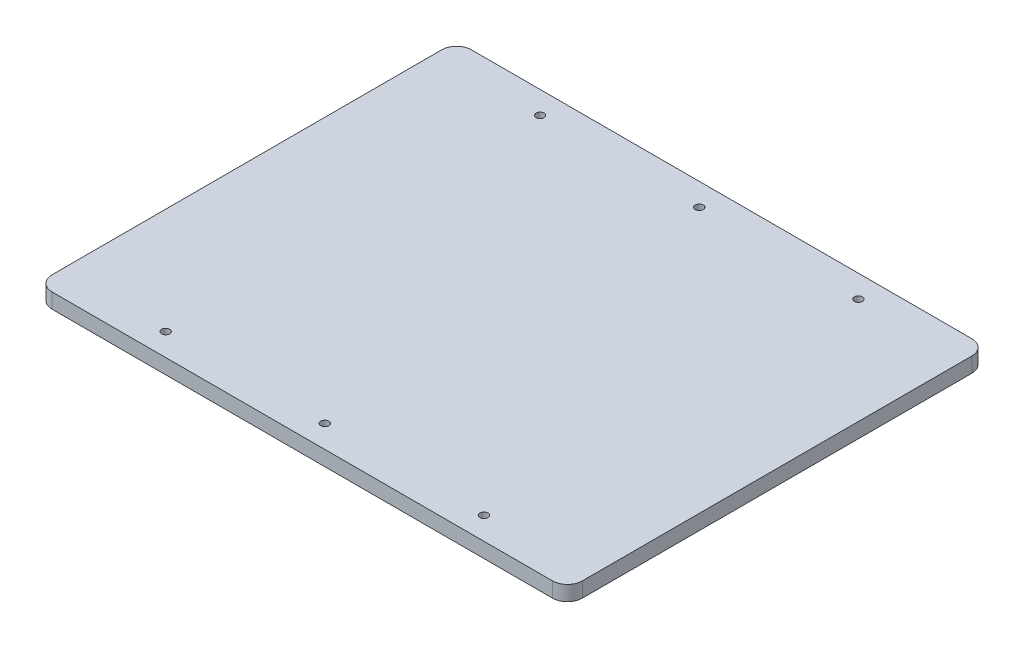
ISO-10303-21;
HEADER;
FILE_DESCRIPTION(('STEP AP214'),'2;1');
FILE_NAME('part.step','',(''),(''),'','','');
FILE_SCHEMA(('AUTOMOTIVE_DESIGN { 1 0 10303 214 1 1 1 1 }'));
ENDSEC;
DATA;
#1=APPLICATION_CONTEXT('core data for automotive mechanical design processes');
#2=APPLICATION_PROTOCOL_DEFINITION('international standard','automotive_design',2000,#1);
#3=PRODUCT_CONTEXT('',#1,'mechanical');
#4=PRODUCT('Part','Part','',(#3));
#5=PRODUCT_RELATED_PRODUCT_CATEGORY('part','',(#4));
#6=PRODUCT_DEFINITION_FORMATION('','',#4);
#7=PRODUCT_DEFINITION_CONTEXT('part definition',#1,'design');
#8=PRODUCT_DEFINITION('design','',#6,#7);
#9=PRODUCT_DEFINITION_SHAPE('','',#8);
#10=(LENGTH_UNIT() NAMED_UNIT(*) SI_UNIT(.MILLI.,.METRE.));
#11=(NAMED_UNIT(*) PLANE_ANGLE_UNIT() SI_UNIT($,.RADIAN.));
#12=(NAMED_UNIT(*) SI_UNIT($,.STERADIAN.) SOLID_ANGLE_UNIT());
#13=UNCERTAINTY_MEASURE_WITH_UNIT(LENGTH_MEASURE(1.E-05),#10,'distance_accuracy_value','');
#14=(GEOMETRIC_REPRESENTATION_CONTEXT(3) GLOBAL_UNCERTAINTY_ASSIGNED_CONTEXT((#13)) GLOBAL_UNIT_ASSIGNED_CONTEXT((#10,
#11,#12)) REPRESENTATION_CONTEXT('',''));
#15=CARTESIAN_POINT('',(0.,0.,0.));
#16=DIRECTION('',(0.,0.,1.));
#17=DIRECTION('',(1.,0.,0.));
#18=AXIS2_PLACEMENT_3D('',#15,#16,#17);
#19=CARTESIAN_POINT('',(-106.045,6.35,82.55));
#20=DIRECTION('',(0.,1.,0.));
#21=DIRECTION('',(0.,0.,1.));
#22=AXIS2_PLACEMENT_3D('',#19,#20,#21);
#23=PLANE('',#22);
#24=CARTESIAN_POINT('',(0.,6.35,79.375));
#25=DIRECTION('',(0.,1.,0.));
#26=DIRECTION('',(0.,0.,-1.));
#27=AXIS2_PLACEMENT_3D('',#24,#25,#26);
#28=CIRCLE('',#27,1.7);
#29=CARTESIAN_POINT('',(0.,6.35,77.675));
#30=VERTEX_POINT('',#29);
#31=EDGE_CURVE('E200',#30,#30,#28,.T.);
#32=ORIENTED_EDGE('',*,*,#31,.F.);
#33=EDGE_LOOP('',(#32));
#34=FACE_BOUND('',#33,.T.);
#35=CARTESIAN_POINT('',(67.46875,6.35,-79.375));
#36=DIRECTION('',(0.,1.,0.));
#37=DIRECTION('',(0.,0.,1.));
#38=AXIS2_PLACEMENT_3D('',#35,#36,#37);
#39=CIRCLE('',#38,1.70000000000001);
#40=CARTESIAN_POINT('',(67.46875,6.35,-77.675));
#41=VERTEX_POINT('',#40);
#42=EDGE_CURVE('E188',#41,#41,#39,.T.);
#43=ORIENTED_EDGE('',*,*,#42,.F.);
#44=EDGE_LOOP('',(#43));
#45=FACE_BOUND('',#44,.T.);
#46=CARTESIAN_POINT('',(-67.47002,6.35,-79.375));
#47=DIRECTION('',(0.,1.,0.));
#48=DIRECTION('',(0.,0.,1.));
#49=AXIS2_PLACEMENT_3D('',#46,#47,#48);
#50=CIRCLE('',#49,1.70000000000001);
#51=CARTESIAN_POINT('',(-67.47002,6.35,-77.675));
#52=VERTEX_POINT('',#51);
#53=EDGE_CURVE('E134',#52,#52,#50,.T.);
#54=ORIENTED_EDGE('',*,*,#53,.F.);
#55=EDGE_LOOP('',(#54));
#56=FACE_BOUND('',#55,.T.);
#57=CARTESIAN_POINT('',(-106.045,6.35,82.55));
#58=DIRECTION('',(0.,1.,0.));
#59=DIRECTION('',(0.,0.,1.));
#60=AXIS2_PLACEMENT_3D('',#57,#58,#59);
#61=CIRCLE('',#60,6.35);
#62=CARTESIAN_POINT('',(-112.395,6.35,82.55));
#63=VERTEX_POINT('',#62);
#64=CARTESIAN_POINT('',(-106.045,6.35,88.9));
#65=VERTEX_POINT('',#64);
#66=EDGE_CURVE('E145',#63,#65,#61,.T.);
#67=ORIENTED_EDGE('',*,*,#66,.T.);
#68=DIRECTION('',(1.,0.,0.));
#69=VECTOR('',#68,1.);
#70=CARTESIAN_POINT('',(-106.045,6.35,88.9));
#71=LINE('',#70,#69);
#72=CARTESIAN_POINT('',(106.045,6.35,88.9));
#73=VERTEX_POINT('',#72);
#74=EDGE_CURVE('E93',#65,#73,#71,.T.);
#75=ORIENTED_EDGE('',*,*,#74,.T.);
#76=CARTESIAN_POINT('',(106.045,6.35,82.55));
#77=DIRECTION('',(0.,1.,0.));
#78=DIRECTION('',(0.,0.,-1.));
#79=AXIS2_PLACEMENT_3D('',#76,#77,#78);
#80=CIRCLE('',#79,6.35);
#81=CARTESIAN_POINT('',(112.395,6.35,82.55));
#82=VERTEX_POINT('',#81);
#83=EDGE_CURVE('E160',#73,#82,#80,.T.);
#84=ORIENTED_EDGE('',*,*,#83,.T.);
#85=DIRECTION('',(0.,0.,-1.));
#86=VECTOR('',#85,1.);
#87=CARTESIAN_POINT('',(112.395,6.35,-82.55));
#88=LINE('',#87,#86);
#89=CARTESIAN_POINT('',(112.395,6.35,-82.55));
#90=VERTEX_POINT('',#89);
#91=EDGE_CURVE('E173',#82,#90,#88,.T.);
#92=ORIENTED_EDGE('',*,*,#91,.T.);
#93=CARTESIAN_POINT('',(106.045,6.35,-82.55));
#94=DIRECTION('',(0.,1.,0.));
#95=DIRECTION('',(0.,0.,1.));
#96=AXIS2_PLACEMENT_3D('',#93,#94,#95);
#97=CIRCLE('',#96,6.35);
#98=CARTESIAN_POINT('',(106.045,6.35,-88.9));
#99=VERTEX_POINT('',#98);
#100=EDGE_CURVE('E112',#90,#99,#97,.T.);
#101=ORIENTED_EDGE('',*,*,#100,.T.);
#102=DIRECTION('',(-1.,0.,0.));
#103=VECTOR('',#102,1.);
#104=CARTESIAN_POINT('',(-106.045,6.35,-88.9));
#105=LINE('',#104,#103);
#106=CARTESIAN_POINT('',(-106.045,6.35,-88.9));
#107=VERTEX_POINT('',#106);
#108=EDGE_CURVE('E106',#99,#107,#105,.T.);
#109=ORIENTED_EDGE('',*,*,#108,.T.);
#110=CARTESIAN_POINT('',(-106.045,6.35,-82.55));
#111=DIRECTION('',(0.,1.,0.));
#112=DIRECTION('',(0.,0.,1.));
#113=AXIS2_PLACEMENT_3D('',#110,#111,#112);
#114=CIRCLE('',#113,6.35);
#115=CARTESIAN_POINT('',(-112.395,6.35,-82.55));
#116=VERTEX_POINT('',#115);
#117=EDGE_CURVE('E110',#107,#116,#114,.T.);
#118=ORIENTED_EDGE('',*,*,#117,.T.);
#119=DIRECTION('',(0.,0.,1.));
#120=VECTOR('',#119,1.);
#121=CARTESIAN_POINT('',(-112.395,6.35,-82.55));
#122=LINE('',#121,#120);
#123=EDGE_CURVE('E50',#116,#63,#122,.T.);
#124=ORIENTED_EDGE('',*,*,#123,.T.);
#125=EDGE_LOOP('',(#67,#75,#84,#92,#101,#109,#118,#124));
#126=FACE_BOUND('',#125,.T.);
#127=CARTESIAN_POINT('',(0.,6.35,-79.375));
#128=DIRECTION('',(0.,1.,0.));
#129=DIRECTION('',(0.,0.,1.));
#130=AXIS2_PLACEMENT_3D('',#127,#128,#129);
#131=CIRCLE('',#130,1.7);
#132=CARTESIAN_POINT('',(0.,6.35,-77.675));
#133=VERTEX_POINT('',#132);
#134=EDGE_CURVE('E182',#133,#133,#131,.T.);
#135=ORIENTED_EDGE('',*,*,#134,.F.);
#136=EDGE_LOOP('',(#135));
#137=FACE_BOUND('',#136,.T.);
#138=CARTESIAN_POINT('',(67.46875,6.35,79.375));
#139=DIRECTION('',(0.,1.,0.));
#140=DIRECTION('',(0.,0.,-1.));
#141=AXIS2_PLACEMENT_3D('',#138,#139,#140);
#142=CIRCLE('',#141,1.70000000000001);
#143=CARTESIAN_POINT('',(67.46875,6.35,77.675));
#144=VERTEX_POINT('',#143);
#145=EDGE_CURVE('E194',#144,#144,#142,.T.);
#146=ORIENTED_EDGE('',*,*,#145,.F.);
#147=EDGE_LOOP('',(#146));
#148=FACE_BOUND('',#147,.T.);
#149=CARTESIAN_POINT('',(-67.47002,6.35,79.375));
#150=DIRECTION('',(0.,1.,0.));
#151=DIRECTION('',(0.,0.,-1.));
#152=AXIS2_PLACEMENT_3D('',#149,#150,#151);
#153=CIRCLE('',#152,1.70000000000001);
#154=CARTESIAN_POINT('',(-67.47002,6.35,77.675));
#155=VERTEX_POINT('',#154);
#156=EDGE_CURVE('E206',#155,#155,#153,.T.);
#157=ORIENTED_EDGE('',*,*,#156,.F.);
#158=EDGE_LOOP('',(#157));
#159=FACE_BOUND('',#158,.T.);
#160=ADVANCED_FACE('F33',(#34,#45,#56,#126,#137,#148,#159),#23,.T.);
#161=CARTESIAN_POINT('',(-106.045,0.,82.55));
#162=DIRECTION('',(0.,1.,0.));
#163=DIRECTION('',(0.,0.,1.));
#164=AXIS2_PLACEMENT_3D('',#161,#162,#163);
#165=PLANE('',#164);
#166=CARTESIAN_POINT('',(0.,0.,79.375));
#167=DIRECTION('',(0.,1.,0.));
#168=DIRECTION('',(0.,0.,-1.));
#169=AXIS2_PLACEMENT_3D('',#166,#167,#168);
#170=CIRCLE('',#169,1.7);
#171=CARTESIAN_POINT('',(0.,0.,77.675));
#172=VERTEX_POINT('',#171);
#173=EDGE_CURVE('E203',#172,#172,#170,.T.);
#174=ORIENTED_EDGE('',*,*,#173,.T.);
#175=EDGE_LOOP('',(#174));
#176=FACE_BOUND('',#175,.T.);
#177=CARTESIAN_POINT('',(67.46875,0.,-79.375));
#178=DIRECTION('',(0.,1.,0.));
#179=DIRECTION('',(0.,0.,1.));
#180=AXIS2_PLACEMENT_3D('',#177,#178,#179);
#181=CIRCLE('',#180,1.70000000000001);
#182=CARTESIAN_POINT('',(67.46875,0.,-77.675));
#183=VERTEX_POINT('',#182);
#184=EDGE_CURVE('E191',#183,#183,#181,.T.);
#185=ORIENTED_EDGE('',*,*,#184,.T.);
#186=EDGE_LOOP('',(#185));
#187=FACE_BOUND('',#186,.T.);
#188=CARTESIAN_POINT('',(-67.47002,0.,-79.375));
#189=DIRECTION('',(0.,1.,0.));
#190=DIRECTION('',(0.,0.,1.));
#191=AXIS2_PLACEMENT_3D('',#188,#189,#190);
#192=CIRCLE('',#191,1.70000000000001);
#193=CARTESIAN_POINT('',(-67.47002,0.,-77.675));
#194=VERTEX_POINT('',#193);
#195=EDGE_CURVE('E179',#194,#194,#192,.T.);
#196=ORIENTED_EDGE('',*,*,#195,.T.);
#197=EDGE_LOOP('',(#196));
#198=FACE_BOUND('',#197,.T.);
#199=CARTESIAN_POINT('',(-106.045,0.,82.55));
#200=DIRECTION('',(0.,1.,0.));
#201=DIRECTION('',(0.,0.,1.));
#202=AXIS2_PLACEMENT_3D('',#199,#200,#201);
#203=CIRCLE('',#202,6.35);
#204=CARTESIAN_POINT('',(-112.395,0.,82.55));
#205=VERTEX_POINT('',#204);
#206=CARTESIAN_POINT('',(-106.045,0.,88.9));
#207=VERTEX_POINT('',#206);
#208=EDGE_CURVE('E130',#205,#207,#203,.T.);
#209=ORIENTED_EDGE('',*,*,#208,.F.);
#210=DIRECTION('',(0.,0.,1.));
#211=VECTOR('',#210,1.);
#212=CARTESIAN_POINT('',(-112.395,0.,-82.55));
#213=LINE('',#212,#211);
#214=CARTESIAN_POINT('',(-112.395,0.,-82.55));
#215=VERTEX_POINT('',#214);
#216=EDGE_CURVE('E85',#215,#205,#213,.T.);
#217=ORIENTED_EDGE('',*,*,#216,.F.);
#218=CARTESIAN_POINT('',(-106.045,0.,-82.55));
#219=DIRECTION('',(0.,1.,0.));
#220=DIRECTION('',(0.,0.,1.));
#221=AXIS2_PLACEMENT_3D('',#218,#219,#220);
#222=CIRCLE('',#221,6.35);
#223=CARTESIAN_POINT('',(-106.045,0.,-88.9));
#224=VERTEX_POINT('',#223);
#225=EDGE_CURVE('E79',#224,#215,#222,.T.);
#226=ORIENTED_EDGE('',*,*,#225,.F.);
#227=DIRECTION('',(-1.,0.,0.));
#228=VECTOR('',#227,1.);
#229=CARTESIAN_POINT('',(-106.045,0.,-88.9));
#230=LINE('',#229,#228);
#231=CARTESIAN_POINT('',(106.045,0.,-88.9));
#232=VERTEX_POINT('',#231);
#233=EDGE_CURVE('E120',#232,#224,#230,.T.);
#234=ORIENTED_EDGE('',*,*,#233,.F.);
#235=CARTESIAN_POINT('',(106.045,0.,-82.55));
#236=DIRECTION('',(0.,1.,0.));
#237=DIRECTION('',(0.,0.,1.));
#238=AXIS2_PLACEMENT_3D('',#235,#236,#237);
#239=CIRCLE('',#238,6.35);
#240=CARTESIAN_POINT('',(112.395,0.,-82.55));
#241=VERTEX_POINT('',#240);
#242=EDGE_CURVE('E140',#241,#232,#239,.T.);
#243=ORIENTED_EDGE('',*,*,#242,.F.);
#244=DIRECTION('',(0.,0.,-1.));
#245=VECTOR('',#244,1.);
#246=CARTESIAN_POINT('',(112.395,0.,-82.55));
#247=LINE('',#246,#245);
#248=CARTESIAN_POINT('',(112.395,0.,82.55));
#249=VERTEX_POINT('',#248);
#250=EDGE_CURVE('E138',#249,#241,#247,.T.);
#251=ORIENTED_EDGE('',*,*,#250,.F.);
#252=CARTESIAN_POINT('',(106.045,0.,82.55));
#253=DIRECTION('',(0.,1.,0.));
#254=DIRECTION('',(0.,0.,-1.));
#255=AXIS2_PLACEMENT_3D('',#252,#253,#254);
#256=CIRCLE('',#255,6.35);
#257=CARTESIAN_POINT('',(106.045,0.,88.9));
#258=VERTEX_POINT('',#257);
#259=EDGE_CURVE('E136',#258,#249,#256,.T.);
#260=ORIENTED_EDGE('',*,*,#259,.F.);
#261=DIRECTION('',(1.,0.,0.));
#262=VECTOR('',#261,1.);
#263=CARTESIAN_POINT('',(-106.045,0.,88.9));
#264=LINE('',#263,#262);
#265=EDGE_CURVE('E133',#207,#258,#264,.T.);
#266=ORIENTED_EDGE('',*,*,#265,.F.);
#267=EDGE_LOOP('',(#209,#217,#226,#234,#243,#251,#260,#266));
#268=FACE_BOUND('',#267,.T.);
#269=CARTESIAN_POINT('',(0.,0.,-79.375));
#270=DIRECTION('',(0.,1.,0.));
#271=DIRECTION('',(0.,0.,1.));
#272=AXIS2_PLACEMENT_3D('',#269,#270,#271);
#273=CIRCLE('',#272,1.7);
#274=CARTESIAN_POINT('',(0.,0.,-77.675));
#275=VERTEX_POINT('',#274);
#276=EDGE_CURVE('E185',#275,#275,#273,.T.);
#277=ORIENTED_EDGE('',*,*,#276,.T.);
#278=EDGE_LOOP('',(#277));
#279=FACE_BOUND('',#278,.T.);
#280=CARTESIAN_POINT('',(67.46875,0.,79.375));
#281=DIRECTION('',(0.,1.,0.));
#282=DIRECTION('',(0.,0.,-1.));
#283=AXIS2_PLACEMENT_3D('',#280,#281,#282);
#284=CIRCLE('',#283,1.70000000000001);
#285=CARTESIAN_POINT('',(67.46875,0.,77.675));
#286=VERTEX_POINT('',#285);
#287=EDGE_CURVE('E197',#286,#286,#284,.T.);
#288=ORIENTED_EDGE('',*,*,#287,.T.);
#289=EDGE_LOOP('',(#288));
#290=FACE_BOUND('',#289,.T.);
#291=CARTESIAN_POINT('',(-67.47002,0.,79.375));
#292=DIRECTION('',(0.,1.,0.));
#293=DIRECTION('',(0.,0.,-1.));
#294=AXIS2_PLACEMENT_3D('',#291,#292,#293);
#295=CIRCLE('',#294,1.70000000000001);
#296=CARTESIAN_POINT('',(-67.47002,0.,77.675));
#297=VERTEX_POINT('',#296);
#298=EDGE_CURVE('E209',#297,#297,#295,.T.);
#299=ORIENTED_EDGE('',*,*,#298,.T.);
#300=EDGE_LOOP('',(#299));
#301=FACE_BOUND('',#300,.T.);
#302=ADVANCED_FACE('F164',(#176,#187,#198,#268,#279,#290,#301),#165,.F.);
#303=CARTESIAN_POINT('',(-106.045,6.35,82.55));
#304=DIRECTION('',(0.,-1.,0.));
#305=DIRECTION('',(0.,0.,-1.));
#306=AXIS2_PLACEMENT_3D('',#303,#304,#305);
#307=CYLINDRICAL_SURFACE('',#306,6.35);
#308=ORIENTED_EDGE('',*,*,#208,.T.);
#309=DIRECTION('',(0.,-1.,0.));
#310=VECTOR('',#309,1.);
#311=CARTESIAN_POINT('',(-106.045,6.35,88.9));
#312=LINE('',#311,#310);
#313=EDGE_CURVE('E11',#65,#207,#312,.T.);
#314=ORIENTED_EDGE('',*,*,#313,.F.);
#315=ORIENTED_EDGE('',*,*,#66,.F.);
#316=DIRECTION('',(0.,-1.,0.));
#317=VECTOR('',#316,1.);
#318=CARTESIAN_POINT('',(-112.395,6.35,82.55));
#319=LINE('',#318,#317);
#320=EDGE_CURVE('E126',#63,#205,#319,.T.);
#321=ORIENTED_EDGE('',*,*,#320,.T.);
#322=EDGE_LOOP('',(#308,#314,#315,#321));
#323=FACE_BOUND('',#322,.T.);
#324=ADVANCED_FACE('F35',(#323),#307,.T.);
#325=CARTESIAN_POINT('',(-106.045,6.35,88.9));
#326=DIRECTION('',(0.,0.,-1.));
#327=DIRECTION('',(-1.,0.,0.));
#328=AXIS2_PLACEMENT_3D('',#325,#326,#327);
#329=PLANE('',#328);
#330=ORIENTED_EDGE('',*,*,#265,.T.);
#331=DIRECTION('',(0.,-1.,0.));
#332=VECTOR('',#331,1.);
#333=CARTESIAN_POINT('',(106.045,6.35,88.9));
#334=LINE('',#333,#332);
#335=EDGE_CURVE('E42',#73,#258,#334,.T.);
#336=ORIENTED_EDGE('',*,*,#335,.F.);
#337=ORIENTED_EDGE('',*,*,#74,.F.);
#338=ORIENTED_EDGE('',*,*,#313,.T.);
#339=EDGE_LOOP('',(#330,#336,#337,#338));
#340=FACE_BOUND('',#339,.T.);
#341=ADVANCED_FACE('F244',(#340),#329,.F.);
#342=CARTESIAN_POINT('',(106.045,6.35,82.55));
#343=DIRECTION('',(0.,-1.,0.));
#344=DIRECTION('',(0.,0.,-1.));
#345=AXIS2_PLACEMENT_3D('',#342,#343,#344);
#346=CYLINDRICAL_SURFACE('',#345,6.35);
#347=ORIENTED_EDGE('',*,*,#259,.T.);
#348=DIRECTION('',(0.,-1.,0.));
#349=VECTOR('',#348,1.);
#350=CARTESIAN_POINT('',(112.395,6.35,82.55));
#351=LINE('',#350,#349);
#352=EDGE_CURVE('E152',#82,#249,#351,.T.);
#353=ORIENTED_EDGE('',*,*,#352,.F.);
#354=ORIENTED_EDGE('',*,*,#83,.F.);
#355=ORIENTED_EDGE('',*,*,#335,.T.);
#356=EDGE_LOOP('',(#347,#353,#354,#355));
#357=FACE_BOUND('',#356,.T.);
#358=ADVANCED_FACE('F158',(#357),#346,.T.);
#359=CARTESIAN_POINT('',(112.395,6.35,-82.55));
#360=DIRECTION('',(-1.,0.,0.));
#361=DIRECTION('',(0.,0.,1.));
#362=AXIS2_PLACEMENT_3D('',#359,#360,#361);
#363=PLANE('',#362);
#364=ORIENTED_EDGE('',*,*,#250,.T.);
#365=DIRECTION('',(0.,-1.,0.));
#366=VECTOR('',#365,1.);
#367=CARTESIAN_POINT('',(112.395,6.35,-82.55));
#368=LINE('',#367,#366);
#369=EDGE_CURVE('E149',#90,#241,#368,.T.);
#370=ORIENTED_EDGE('',*,*,#369,.F.);
#371=ORIENTED_EDGE('',*,*,#91,.F.);
#372=ORIENTED_EDGE('',*,*,#352,.T.);
#373=EDGE_LOOP('',(#364,#370,#371,#372));
#374=FACE_BOUND('',#373,.T.);
#375=ADVANCED_FACE('F169',(#374),#363,.F.);
#376=CARTESIAN_POINT('',(106.045,6.35,-82.55));
#377=DIRECTION('',(0.,-1.,0.));
#378=DIRECTION('',(0.,0.,-1.));
#379=AXIS2_PLACEMENT_3D('',#376,#377,#378);
#380=CYLINDRICAL_SURFACE('',#379,6.35);
#381=ORIENTED_EDGE('',*,*,#242,.T.);
#382=DIRECTION('',(0.,-1.,0.));
#383=VECTOR('',#382,1.);
#384=CARTESIAN_POINT('',(106.045,6.35,-88.9));
#385=LINE('',#384,#383);
#386=EDGE_CURVE('E121',#99,#232,#385,.T.);
#387=ORIENTED_EDGE('',*,*,#386,.F.);
#388=ORIENTED_EDGE('',*,*,#100,.F.);
#389=ORIENTED_EDGE('',*,*,#369,.T.);
#390=EDGE_LOOP('',(#381,#387,#388,#389));
#391=FACE_BOUND('',#390,.T.);
#392=ADVANCED_FACE('F172',(#391),#380,.T.);
#393=CARTESIAN_POINT('',(-106.045,6.35,-88.9));
#394=DIRECTION('',(0.,0.,1.));
#395=DIRECTION('',(1.,0.,0.));
#396=AXIS2_PLACEMENT_3D('',#393,#394,#395);
#397=PLANE('',#396);
#398=ORIENTED_EDGE('',*,*,#233,.T.);
#399=DIRECTION('',(0.,-1.,0.));
#400=VECTOR('',#399,1.);
#401=CARTESIAN_POINT('',(-106.045,6.35,-88.9));
#402=LINE('',#401,#400);
#403=EDGE_CURVE('E117',#107,#224,#402,.T.);
#404=ORIENTED_EDGE('',*,*,#403,.F.);
#405=ORIENTED_EDGE('',*,*,#108,.F.);
#406=ORIENTED_EDGE('',*,*,#386,.T.);
#407=EDGE_LOOP('',(#398,#404,#405,#406));
#408=FACE_BOUND('',#407,.T.);
#409=ADVANCED_FACE('F118',(#408),#397,.F.);
#410=CARTESIAN_POINT('',(-106.045,6.35,-82.55));
#411=DIRECTION('',(0.,-1.,0.));
#412=DIRECTION('',(0.,0.,-1.));
#413=AXIS2_PLACEMENT_3D('',#410,#411,#412);
#414=CYLINDRICAL_SURFACE('',#413,6.35);
#415=ORIENTED_EDGE('',*,*,#225,.T.);
#416=DIRECTION('',(0.,-1.,0.));
#417=VECTOR('',#416,1.);
#418=CARTESIAN_POINT('',(-112.395,6.35,-82.55));
#419=LINE('',#418,#417);
#420=EDGE_CURVE('E122',#116,#215,#419,.T.);
#421=ORIENTED_EDGE('',*,*,#420,.F.);
#422=ORIENTED_EDGE('',*,*,#117,.F.);
#423=ORIENTED_EDGE('',*,*,#403,.T.);
#424=EDGE_LOOP('',(#415,#421,#422,#423));
#425=FACE_BOUND('',#424,.T.);
#426=ADVANCED_FACE('F124',(#425),#414,.T.);
#427=CARTESIAN_POINT('',(-112.395,6.35,-82.55));
#428=DIRECTION('',(1.,0.,0.));
#429=DIRECTION('',(0.,0.,-1.));
#430=AXIS2_PLACEMENT_3D('',#427,#428,#429);
#431=PLANE('',#430);
#432=ORIENTED_EDGE('',*,*,#216,.T.);
#433=ORIENTED_EDGE('',*,*,#320,.F.);
#434=ORIENTED_EDGE('',*,*,#123,.F.);
#435=ORIENTED_EDGE('',*,*,#420,.T.);
#436=EDGE_LOOP('',(#432,#433,#434,#435));
#437=FACE_BOUND('',#436,.T.);
#438=ADVANCED_FACE('F232',(#437),#431,.F.);
#439=CARTESIAN_POINT('',(-67.47002,6.35,-79.375));
#440=DIRECTION('',(0.,-1.,0.));
#441=DIRECTION('',(0.,0.,-1.));
#442=AXIS2_PLACEMENT_3D('',#439,#440,#441);
#443=CYLINDRICAL_SURFACE('',#442,1.70000000000001);
#444=ORIENTED_EDGE('',*,*,#53,.T.);
#445=EDGE_LOOP('',(#444));
#446=FACE_BOUND('',#445,.T.);
#447=ORIENTED_EDGE('',*,*,#195,.F.);
#448=EDGE_LOOP('',(#447));
#449=FACE_BOUND('',#448,.T.);
#450=ADVANCED_FACE('F229',(#446,#449),#443,.F.);
#451=CARTESIAN_POINT('',(0.,6.35,-79.375));
#452=DIRECTION('',(0.,-1.,0.));
#453=DIRECTION('',(0.,0.,-1.));
#454=AXIS2_PLACEMENT_3D('',#451,#452,#453);
#455=CYLINDRICAL_SURFACE('',#454,1.7);
#456=ORIENTED_EDGE('',*,*,#134,.T.);
#457=EDGE_LOOP('',(#456));
#458=FACE_BOUND('',#457,.T.);
#459=ORIENTED_EDGE('',*,*,#276,.F.);
#460=EDGE_LOOP('',(#459));
#461=FACE_BOUND('',#460,.T.);
#462=ADVANCED_FACE('F308',(#458,#461),#455,.F.);
#463=CARTESIAN_POINT('',(67.46875,6.35,-79.375));
#464=DIRECTION('',(0.,-1.,0.));
#465=DIRECTION('',(0.,0.,-1.));
#466=AXIS2_PLACEMENT_3D('',#463,#464,#465);
#467=CYLINDRICAL_SURFACE('',#466,1.70000000000001);
#468=ORIENTED_EDGE('',*,*,#42,.T.);
#469=EDGE_LOOP('',(#468));
#470=FACE_BOUND('',#469,.T.);
#471=ORIENTED_EDGE('',*,*,#184,.F.);
#472=EDGE_LOOP('',(#471));
#473=FACE_BOUND('',#472,.T.);
#474=ADVANCED_FACE('F316',(#470,#473),#467,.F.);
#475=CARTESIAN_POINT('',(67.46875,6.35,79.375));
#476=DIRECTION('',(0.,-1.,0.));
#477=DIRECTION('',(0.,0.,-1.));
#478=AXIS2_PLACEMENT_3D('',#475,#476,#477);
#479=CYLINDRICAL_SURFACE('',#478,1.70000000000001);
#480=ORIENTED_EDGE('',*,*,#145,.T.);
#481=EDGE_LOOP('',(#480));
#482=FACE_BOUND('',#481,.T.);
#483=ORIENTED_EDGE('',*,*,#287,.F.);
#484=EDGE_LOOP('',(#483));
#485=FACE_BOUND('',#484,.T.);
#486=ADVANCED_FACE('F324',(#482,#485),#479,.F.);
#487=CARTESIAN_POINT('',(0.,6.35,79.375));
#488=DIRECTION('',(0.,-1.,0.));
#489=DIRECTION('',(0.,0.,-1.));
#490=AXIS2_PLACEMENT_3D('',#487,#488,#489);
#491=CYLINDRICAL_SURFACE('',#490,1.7);
#492=ORIENTED_EDGE('',*,*,#31,.T.);
#493=EDGE_LOOP('',(#492));
#494=FACE_BOUND('',#493,.T.);
#495=ORIENTED_EDGE('',*,*,#173,.F.);
#496=EDGE_LOOP('',(#495));
#497=FACE_BOUND('',#496,.T.);
#498=ADVANCED_FACE('F333',(#494,#497),#491,.F.);
#499=CARTESIAN_POINT('',(-67.47002,6.35,79.375));
#500=DIRECTION('',(0.,-1.,0.));
#501=DIRECTION('',(0.,0.,-1.));
#502=AXIS2_PLACEMENT_3D('',#499,#500,#501);
#503=CYLINDRICAL_SURFACE('',#502,1.70000000000001);
#504=ORIENTED_EDGE('',*,*,#156,.T.);
#505=EDGE_LOOP('',(#504));
#506=FACE_BOUND('',#505,.T.);
#507=ORIENTED_EDGE('',*,*,#298,.F.);
#508=EDGE_LOOP('',(#507));
#509=FACE_BOUND('',#508,.T.);
#510=ADVANCED_FACE('F215',(#506,#509),#503,.F.);
#511=CLOSED_SHELL('',(#160,#302,#324,#341,#358,#375,#392,#409,#426,#438,#450,#462,#474,#486,
#498,#510));
#512=MANIFOLD_SOLID_BREP('B2',#511);
#513=ADVANCED_BREP_SHAPE_REPRESENTATION('',(#18,#512),#14);
#514=SHAPE_DEFINITION_REPRESENTATION(#9,#513);
ENDSEC;
END-ISO-10303-21;
